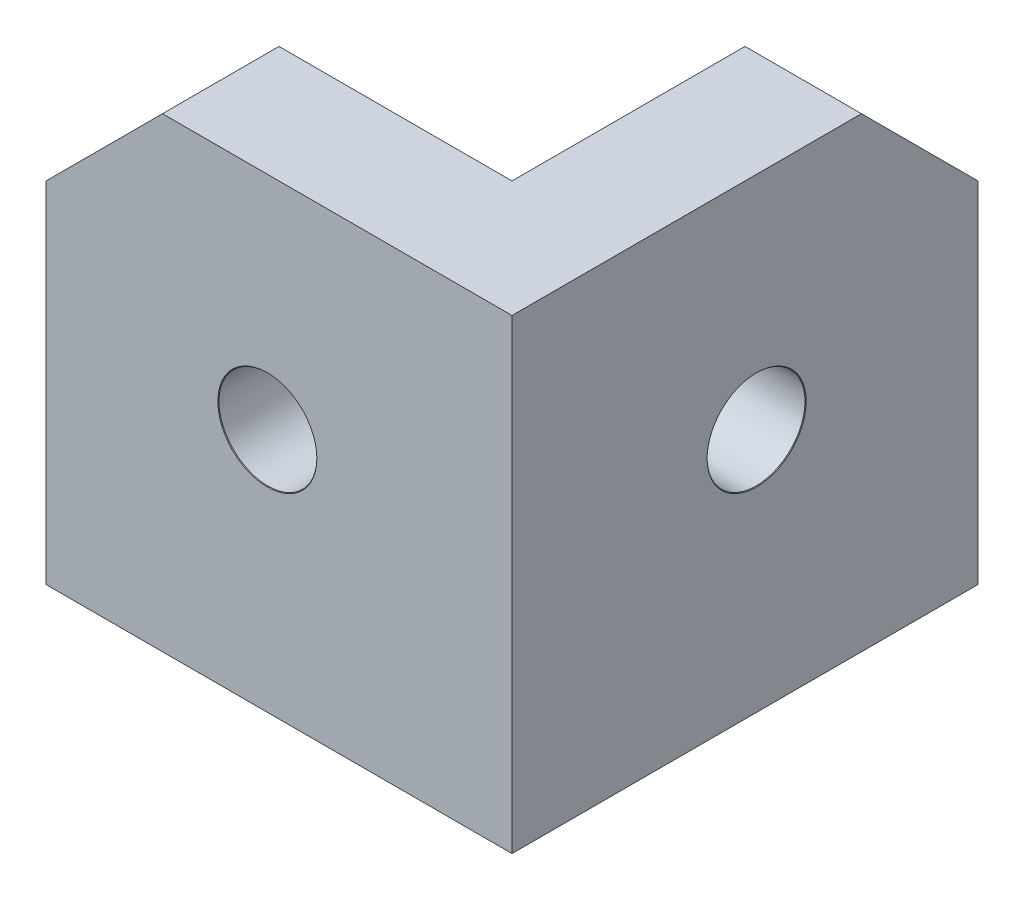
ISO-10303-21;
HEADER;
FILE_DESCRIPTION(('STEP AP214'),'2;1');
FILE_NAME('part.step','',(''),(''),'','','');
FILE_SCHEMA(('AUTOMOTIVE_DESIGN { 1 0 10303 214 1 1 1 1 }'));
ENDSEC;
DATA;
#1=APPLICATION_CONTEXT('core data for automotive mechanical design processes');
#2=APPLICATION_PROTOCOL_DEFINITION('international standard','automotive_design',2000,#1);
#3=PRODUCT_CONTEXT('',#1,'mechanical');
#4=PRODUCT('Part','Part','',(#3));
#5=PRODUCT_RELATED_PRODUCT_CATEGORY('part','',(#4));
#6=PRODUCT_DEFINITION_FORMATION('','',#4);
#7=PRODUCT_DEFINITION_CONTEXT('part definition',#1,'design');
#8=PRODUCT_DEFINITION('design','',#6,#7);
#9=PRODUCT_DEFINITION_SHAPE('','',#8);
#10=(LENGTH_UNIT() NAMED_UNIT(*) SI_UNIT(.MILLI.,.METRE.));
#11=(NAMED_UNIT(*) PLANE_ANGLE_UNIT() SI_UNIT($,.RADIAN.));
#12=(NAMED_UNIT(*) SI_UNIT($,.STERADIAN.) SOLID_ANGLE_UNIT());
#13=UNCERTAINTY_MEASURE_WITH_UNIT(LENGTH_MEASURE(1.E-05),#10,'distance_accuracy_value','');
#14=(GEOMETRIC_REPRESENTATION_CONTEXT(3) GLOBAL_UNCERTAINTY_ASSIGNED_CONTEXT((#13)) GLOBAL_UNIT_ASSIGNED_CONTEXT((#10,
#11,#12)) REPRESENTATION_CONTEXT('',''));
#15=CARTESIAN_POINT('',(0.,0.,0.));
#16=DIRECTION('',(0.,0.,1.));
#17=DIRECTION('',(1.,0.,0.));
#18=AXIS2_PLACEMENT_3D('',#15,#16,#17);
#19=CARTESIAN_POINT('',(0.,5.,0.));
#20=DIRECTION('',(0.,0.,1.));
#21=DIRECTION('',(1.,0.,0.));
#22=AXIS2_PLACEMENT_3D('',#19,#20,#21);
#23=PLANE('',#22);
#24=CARTESIAN_POINT('',(9.5,10.5,0.));
#25=DIRECTION('',(0.,0.,1.));
#26=DIRECTION('',(1.,0.,0.));
#27=AXIS2_PLACEMENT_3D('',#24,#25,#26);
#28=CIRCLE('',#27,2.125);
#29=CARTESIAN_POINT('',(11.625,10.5,0.));
#30=VERTEX_POINT('',#29);
#31=EDGE_CURVE('E211',#30,#30,#28,.T.);
#32=ORIENTED_EDGE('',*,*,#31,.F.);
#33=EDGE_LOOP('',(#32));
#34=FACE_BOUND('',#33,.T.);
#35=DIRECTION('',(1.,0.,0.));
#36=VECTOR('',#35,1.);
#37=CARTESIAN_POINT('',(0.,20.,0.));
#38=LINE('',#37,#36);
#39=CARTESIAN_POINT('',(5.00000000000002,20.,0.));
#40=VERTEX_POINT('',#39);
#41=CARTESIAN_POINT('',(20.,20.,0.));
#42=VERTEX_POINT('',#41);
#43=EDGE_CURVE('E144',#40,#42,#38,.T.);
#44=ORIENTED_EDGE('',*,*,#43,.F.);
#45=DIRECTION('',(0.707106781186548,0.707106781186547,0.));
#46=VECTOR('',#45,1.);
#47=CARTESIAN_POINT('',(-5.,10.,0.));
#48=LINE('',#47,#46);
#49=CARTESIAN_POINT('',(0.,15.,0.));
#50=VERTEX_POINT('',#49);
#51=EDGE_CURVE('E218',#40,#50,#48,.F.);
#52=ORIENTED_EDGE('',*,*,#51,.T.);
#53=DIRECTION('',(0.,-1.,0.));
#54=VECTOR('',#53,1.);
#55=CARTESIAN_POINT('',(0.,5.,0.));
#56=LINE('',#55,#54);
#57=CARTESIAN_POINT('',(0.,0.,0.));
#58=VERTEX_POINT('',#57);
#59=EDGE_CURVE('E179',#50,#58,#56,.T.);
#60=ORIENTED_EDGE('',*,*,#59,.T.);
#61=DIRECTION('',(-1.,0.,0.));
#62=VECTOR('',#61,1.);
#63=CARTESIAN_POINT('',(0.,0.,0.));
#64=LINE('',#63,#62);
#65=CARTESIAN_POINT('',(20.,0.,0.));
#66=VERTEX_POINT('',#65);
#67=EDGE_CURVE('E170',#66,#58,#64,.T.);
#68=ORIENTED_EDGE('',*,*,#67,.F.);
#69=DIRECTION('',(0.,-1.,0.));
#70=VECTOR('',#69,1.);
#71=CARTESIAN_POINT('',(20.,5.,0.));
#72=LINE('',#71,#70);
#73=EDGE_CURVE('E199',#42,#66,#72,.T.);
#74=ORIENTED_EDGE('',*,*,#73,.F.);
#75=EDGE_LOOP('',(#44,#52,#60,#68,#74));
#76=FACE_BOUND('',#75,.T.);
#77=ADVANCED_FACE('F40',(#34,#76),#23,.T.);
#78=CARTESIAN_POINT('',(20.,5.,0.));
#79=DIRECTION('',(-1.,0.,0.));
#80=DIRECTION('',(0.,0.,1.));
#81=AXIS2_PLACEMENT_3D('',#78,#79,#80);
#82=PLANE('',#81);
#83=CARTESIAN_POINT('',(20.,10.5,-10.5));
#84=DIRECTION('',(1.,0.,0.));
#85=DIRECTION('',(0.,0.,-1.));
#86=AXIS2_PLACEMENT_3D('',#83,#84,#85);
#87=CIRCLE('',#86,2.125);
#88=CARTESIAN_POINT('',(20.,10.5,-12.625));
#89=VERTEX_POINT('',#88);
#90=EDGE_CURVE('E501',#89,#89,#87,.T.);
#91=ORIENTED_EDGE('',*,*,#90,.F.);
#92=EDGE_LOOP('',(#91));
#93=FACE_BOUND('',#92,.T.);
#94=DIRECTION('',(0.,-1.,0.));
#95=VECTOR('',#94,1.);
#96=CARTESIAN_POINT('',(20.,5.,-20.));
#97=LINE('',#96,#95);
#98=CARTESIAN_POINT('',(20.,15.,-20.));
#99=VERTEX_POINT('',#98);
#100=CARTESIAN_POINT('',(20.,0.,-20.));
#101=VERTEX_POINT('',#100);
#102=EDGE_CURVE('E196',#99,#101,#97,.T.);
#103=ORIENTED_EDGE('',*,*,#102,.F.);
#104=DIRECTION('',(0.,-0.707106781186547,-0.707106781186548));
#105=VECTOR('',#104,1.);
#106=CARTESIAN_POINT('',(20.,20.,-15.));
#107=LINE('',#106,#105);
#108=CARTESIAN_POINT('',(20.,20.,-15.));
#109=VERTEX_POINT('',#108);
#110=EDGE_CURVE('E237',#99,#109,#107,.F.);
#111=ORIENTED_EDGE('',*,*,#110,.T.);
#112=DIRECTION('',(0.,0.,-1.));
#113=VECTOR('',#112,1.);
#114=CARTESIAN_POINT('',(20.,20.,0.));
#115=LINE('',#114,#113);
#116=EDGE_CURVE('E264',#42,#109,#115,.T.);
#117=ORIENTED_EDGE('',*,*,#116,.F.);
#118=ORIENTED_EDGE('',*,*,#73,.T.);
#119=DIRECTION('',(0.,0.,-1.));
#120=VECTOR('',#119,1.);
#121=CARTESIAN_POINT('',(20.,0.,0.));
#122=LINE('',#121,#120);
#123=EDGE_CURVE('E183',#66,#101,#122,.T.);
#124=ORIENTED_EDGE('',*,*,#123,.T.);
#125=EDGE_LOOP('',(#103,#111,#117,#118,#124));
#126=FACE_BOUND('',#125,.T.);
#127=ADVANCED_FACE('F277',(#93,#126),#82,.F.);
#128=CARTESIAN_POINT('',(0.,5.,-20.));
#129=DIRECTION('',(0.,0.,-1.));
#130=DIRECTION('',(-1.,0.,0.));
#131=AXIS2_PLACEMENT_3D('',#128,#129,#130);
#132=PLANE('',#131);
#133=DIRECTION('',(0.,-1.,0.));
#134=VECTOR('',#133,1.);
#135=CARTESIAN_POINT('',(15.,20.,-20.));
#136=LINE('',#135,#134);
#137=CARTESIAN_POINT('',(15.,15.,-20.));
#138=VERTEX_POINT('',#137);
#139=CARTESIAN_POINT('',(15.,5.,-20.));
#140=VERTEX_POINT('',#139);
#141=EDGE_CURVE('E159',#138,#140,#136,.T.);
#142=ORIENTED_EDGE('',*,*,#141,.F.);
#143=DIRECTION('',(1.,0.,0.));
#144=VECTOR('',#143,1.);
#145=CARTESIAN_POINT('',(0.,15.,-20.));
#146=LINE('',#145,#144);
#147=EDGE_CURVE('E57',#138,#99,#146,.T.);
#148=ORIENTED_EDGE('',*,*,#147,.T.);
#149=ORIENTED_EDGE('',*,*,#102,.T.);
#150=DIRECTION('',(1.,0.,0.));
#151=VECTOR('',#150,1.);
#152=CARTESIAN_POINT('',(0.,0.,-20.));
#153=LINE('',#152,#151);
#154=CARTESIAN_POINT('',(5.,0.,-20.));
#155=VERTEX_POINT('',#154);
#156=EDGE_CURVE('E187',#155,#101,#153,.T.);
#157=ORIENTED_EDGE('',*,*,#156,.F.);
#158=DIRECTION('',(0.,1.,0.));
#159=VECTOR('',#158,1.);
#160=CARTESIAN_POINT('',(5.,5.,-20.));
#161=LINE('',#160,#159);
#162=CARTESIAN_POINT('',(5.,5.,-20.));
#163=VERTEX_POINT('',#162);
#164=EDGE_CURVE('E64',#155,#163,#161,.T.);
#165=ORIENTED_EDGE('',*,*,#164,.T.);
#166=DIRECTION('',(1.,0.,0.));
#167=VECTOR('',#166,1.);
#168=CARTESIAN_POINT('',(0.,5.,-20.));
#169=LINE('',#168,#167);
#170=EDGE_CURVE('E171',#163,#140,#169,.T.);
#171=ORIENTED_EDGE('',*,*,#170,.T.);
#172=EDGE_LOOP('',(#142,#148,#149,#157,#165,#171));
#173=FACE_BOUND('',#172,.T.);
#174=ADVANCED_FACE('F246',(#173),#132,.T.);
#175=CARTESIAN_POINT('',(0.,5.,0.));
#176=DIRECTION('',(-1.,0.,0.));
#177=DIRECTION('',(0.,0.,1.));
#178=AXIS2_PLACEMENT_3D('',#175,#176,#177);
#179=PLANE('',#178);
#180=ORIENTED_EDGE('',*,*,#59,.F.);
#181=DIRECTION('',(0.,0.,-1.));
#182=VECTOR('',#181,1.);
#183=CARTESIAN_POINT('',(0.,15.,0.));
#184=LINE('',#183,#182);
#185=CARTESIAN_POINT('',(0.,15.,-5.));
#186=VERTEX_POINT('',#185);
#187=EDGE_CURVE('E225',#50,#186,#184,.T.);
#188=ORIENTED_EDGE('',*,*,#187,.T.);
#189=DIRECTION('',(0.,-1.,0.));
#190=VECTOR('',#189,1.);
#191=CARTESIAN_POINT('',(0.,20.,-5.));
#192=LINE('',#191,#190);
#193=CARTESIAN_POINT('',(0.,5.,-5.));
#194=VERTEX_POINT('',#193);
#195=EDGE_CURVE('E152',#186,#194,#192,.T.);
#196=ORIENTED_EDGE('',*,*,#195,.T.);
#197=DIRECTION('',(0.,0.,-1.));
#198=VECTOR('',#197,1.);
#199=CARTESIAN_POINT('',(0.,5.,0.));
#200=LINE('',#199,#198);
#201=CARTESIAN_POINT('',(0.,5.,-15.));
#202=VERTEX_POINT('',#201);
#203=EDGE_CURVE('E174',#194,#202,#200,.T.);
#204=ORIENTED_EDGE('',*,*,#203,.T.);
#205=DIRECTION('',(0.,-1.,0.));
#206=VECTOR('',#205,1.);
#207=CARTESIAN_POINT('',(0.,5.,-15.));
#208=LINE('',#207,#206);
#209=CARTESIAN_POINT('',(0.,0.,-15.));
#210=VERTEX_POINT('',#209);
#211=EDGE_CURVE('E221',#202,#210,#208,.T.);
#212=ORIENTED_EDGE('',*,*,#211,.T.);
#213=DIRECTION('',(0.,0.,-1.));
#214=VECTOR('',#213,1.);
#215=CARTESIAN_POINT('',(0.,0.,0.));
#216=LINE('',#215,#214);
#217=EDGE_CURVE('E175',#58,#210,#216,.T.);
#218=ORIENTED_EDGE('',*,*,#217,.F.);
#219=EDGE_LOOP('',(#180,#188,#196,#204,#212,#218));
#220=FACE_BOUND('',#219,.T.);
#221=ADVANCED_FACE('F254',(#220),#179,.T.);
#222=CARTESIAN_POINT('',(0.,5.,0.));
#223=DIRECTION('',(0.,1.,0.));
#224=DIRECTION('',(0.,0.,1.));
#225=AXIS2_PLACEMENT_3D('',#222,#223,#224);
#226=PLANE('',#225);
#227=ORIENTED_EDGE('',*,*,#170,.F.);
#228=DIRECTION('',(0.707106781186546,0.,-0.707106781186549));
#229=VECTOR('',#228,1.);
#230=CARTESIAN_POINT('',(-7.49999999999999,5.,-7.49999999999996));
#231=LINE('',#230,#229);
#232=EDGE_CURVE('E11',#163,#202,#231,.F.);
#233=ORIENTED_EDGE('',*,*,#232,.T.);
#234=ORIENTED_EDGE('',*,*,#203,.F.);
#235=DIRECTION('',(-1.,0.,0.));
#236=VECTOR('',#235,1.);
#237=CARTESIAN_POINT('',(0.,5.,-5.));
#238=LINE('',#237,#236);
#239=CARTESIAN_POINT('',(15.,5.,-5.));
#240=VERTEX_POINT('',#239);
#241=EDGE_CURVE('E132',#240,#194,#238,.T.);
#242=ORIENTED_EDGE('',*,*,#241,.F.);
#243=DIRECTION('',(0.,0.,1.));
#244=VECTOR('',#243,1.);
#245=CARTESIAN_POINT('',(15.,5.,0.));
#246=LINE('',#245,#244);
#247=EDGE_CURVE('E149',#140,#240,#246,.T.);
#248=ORIENTED_EDGE('',*,*,#247,.F.);
#249=EDGE_LOOP('',(#227,#233,#234,#242,#248));
#250=FACE_BOUND('',#249,.T.);
#251=CARTESIAN_POINT('',(9.5,5.,-10.5));
#252=DIRECTION('',(0.,-1.,0.));
#253=DIRECTION('',(0.,0.,-1.));
#254=AXIS2_PLACEMENT_3D('',#251,#252,#253);
#255=CIRCLE('',#254,2.1);
#256=CARTESIAN_POINT('',(9.5,5.,-12.6));
#257=VERTEX_POINT('',#256);
#258=EDGE_CURVE('E166',#257,#257,#255,.T.);
#259=ORIENTED_EDGE('',*,*,#258,.T.);
#260=EDGE_LOOP('',(#259));
#261=FACE_BOUND('',#260,.T.);
#262=ADVANCED_FACE('F250',(#250,#261),#226,.T.);
#263=CARTESIAN_POINT('',(0.,0.,0.));
#264=DIRECTION('',(0.,1.,0.));
#265=DIRECTION('',(0.,0.,1.));
#266=AXIS2_PLACEMENT_3D('',#263,#264,#265);
#267=PLANE('',#266);
#268=CARTESIAN_POINT('',(9.5,0.,-10.5));
#269=DIRECTION('',(0.,-1.,0.));
#270=DIRECTION('',(0.,0.,-1.));
#271=AXIS2_PLACEMENT_3D('',#268,#269,#270);
#272=CIRCLE('',#271,2.125);
#273=CARTESIAN_POINT('',(9.5,0.,-12.625));
#274=VERTEX_POINT('',#273);
#275=EDGE_CURVE('E151',#274,#274,#272,.T.);
#276=ORIENTED_EDGE('',*,*,#275,.F.);
#277=EDGE_LOOP('',(#276));
#278=FACE_BOUND('',#277,.T.);
#279=ORIENTED_EDGE('',*,*,#217,.T.);
#280=DIRECTION('',(-0.707106781186546,0.,0.707106781186549));
#281=VECTOR('',#280,1.);
#282=CARTESIAN_POINT('',(0.,0.,-15.));
#283=LINE('',#282,#281);
#284=EDGE_CURVE('E50',#210,#155,#283,.F.);
#285=ORIENTED_EDGE('',*,*,#284,.T.);
#286=ORIENTED_EDGE('',*,*,#156,.T.);
#287=ORIENTED_EDGE('',*,*,#123,.F.);
#288=ORIENTED_EDGE('',*,*,#67,.T.);
#289=EDGE_LOOP('',(#279,#285,#286,#287,#288));
#290=FACE_BOUND('',#289,.T.);
#291=ADVANCED_FACE('F241',(#278,#290),#267,.F.);
#292=CARTESIAN_POINT('',(9.5,0.,-10.5));
#293=DIRECTION('',(0.,-1.,0.));
#294=DIRECTION('',(0.,0.,-1.));
#295=AXIS2_PLACEMENT_3D('',#292,#293,#294);
#296=CYLINDRICAL_SURFACE('',#295,2.1);
#297=ORIENTED_EDGE('',*,*,#258,.F.);
#298=EDGE_LOOP('',(#297));
#299=FACE_BOUND('',#298,.T.);
#300=CARTESIAN_POINT('',(9.5,0.0250000000000013,-10.5));
#301=DIRECTION('',(0.,-1.,0.));
#302=DIRECTION('',(0.,0.,-1.));
#303=AXIS2_PLACEMENT_3D('',#300,#301,#302);
#304=CIRCLE('',#303,2.1);
#305=CARTESIAN_POINT('',(9.5,0.0250000000000013,-12.6));
#306=VERTEX_POINT('',#305);
#307=EDGE_CURVE('E157',#306,#306,#304,.T.);
#308=ORIENTED_EDGE('',*,*,#307,.T.);
#309=EDGE_LOOP('',(#308));
#310=FACE_BOUND('',#309,.T.);
#311=ADVANCED_FACE('F349',(#299,#310),#296,.F.);
#312=CARTESIAN_POINT('',(9.5,0.,-10.5));
#313=DIRECTION('',(0.,-1.,0.));
#314=DIRECTION('',(0.,0.,-1.));
#315=AXIS2_PLACEMENT_3D('',#312,#313,#314);
#316=CONICAL_SURFACE('',#315,2.125,0.785398163397437);
#317=ORIENTED_EDGE('',*,*,#307,.F.);
#318=EDGE_LOOP('',(#317));
#319=FACE_BOUND('',#318,.T.);
#320=ORIENTED_EDGE('',*,*,#275,.T.);
#321=EDGE_LOOP('',(#320));
#322=FACE_BOUND('',#321,.T.);
#323=ADVANCED_FACE('F340',(#319,#322),#316,.F.);
#324=CARTESIAN_POINT('',(15.,20.,0.));
#325=DIRECTION('',(1.,0.,0.));
#326=DIRECTION('',(0.,0.,-1.));
#327=AXIS2_PLACEMENT_3D('',#324,#325,#326);
#328=PLANE('',#327);
#329=CARTESIAN_POINT('',(15.,10.5,-10.5));
#330=DIRECTION('',(1.,0.,0.));
#331=DIRECTION('',(0.,0.,-1.));
#332=AXIS2_PLACEMENT_3D('',#329,#330,#331);
#333=CIRCLE('',#332,2.09999999999999);
#334=CARTESIAN_POINT('',(15.,10.5,-12.6));
#335=VERTEX_POINT('',#334);
#336=EDGE_CURVE('E207',#335,#335,#333,.T.);
#337=ORIENTED_EDGE('',*,*,#336,.T.);
#338=EDGE_LOOP('',(#337));
#339=FACE_BOUND('',#338,.T.);
#340=DIRECTION('',(0.,0.,1.));
#341=VECTOR('',#340,1.);
#342=CARTESIAN_POINT('',(15.,20.,0.));
#343=LINE('',#342,#341);
#344=CARTESIAN_POINT('',(15.,20.,-15.));
#345=VERTEX_POINT('',#344);
#346=CARTESIAN_POINT('',(15.,20.,-5.));
#347=VERTEX_POINT('',#346);
#348=EDGE_CURVE('E120',#345,#347,#343,.T.);
#349=ORIENTED_EDGE('',*,*,#348,.F.);
#350=DIRECTION('',(0.,0.707106781186547,0.707106781186548));
#351=VECTOR('',#350,1.);
#352=CARTESIAN_POINT('',(15.,20.,-15.));
#353=LINE('',#352,#351);
#354=EDGE_CURVE('E230',#345,#138,#353,.F.);
#355=ORIENTED_EDGE('',*,*,#354,.T.);
#356=ORIENTED_EDGE('',*,*,#141,.T.);
#357=ORIENTED_EDGE('',*,*,#247,.T.);
#358=DIRECTION('',(0.,-1.,0.));
#359=VECTOR('',#358,1.);
#360=CARTESIAN_POINT('',(15.,20.,-5.));
#361=LINE('',#360,#359);
#362=EDGE_CURVE('E139',#347,#240,#361,.T.);
#363=ORIENTED_EDGE('',*,*,#362,.F.);
#364=EDGE_LOOP('',(#349,#355,#356,#357,#363));
#365=FACE_BOUND('',#364,.T.);
#366=ADVANCED_FACE('F146',(#339,#365),#328,.F.);
#367=CARTESIAN_POINT('',(0.,20.,-5.));
#368=DIRECTION('',(0.,0.,1.));
#369=DIRECTION('',(1.,0.,0.));
#370=AXIS2_PLACEMENT_3D('',#367,#368,#369);
#371=PLANE('',#370);
#372=CARTESIAN_POINT('',(9.5,10.5,-5.));
#373=DIRECTION('',(0.,0.,1.));
#374=DIRECTION('',(1.,0.,0.));
#375=AXIS2_PLACEMENT_3D('',#372,#373,#374);
#376=CIRCLE('',#375,2.09999999999999);
#377=CARTESIAN_POINT('',(11.6,10.5,-5.));
#378=VERTEX_POINT('',#377);
#379=EDGE_CURVE('E202',#378,#378,#376,.T.);
#380=ORIENTED_EDGE('',*,*,#379,.T.);
#381=EDGE_LOOP('',(#380));
#382=FACE_BOUND('',#381,.T.);
#383=ORIENTED_EDGE('',*,*,#195,.F.);
#384=DIRECTION('',(-0.707106781186548,-0.707106781186547,0.));
#385=VECTOR('',#384,1.);
#386=CARTESIAN_POINT('',(5.00000000000002,20.,-5.));
#387=LINE('',#386,#385);
#388=CARTESIAN_POINT('',(5.00000000000002,20.,-5.));
#389=VERTEX_POINT('',#388);
#390=EDGE_CURVE('E142',#186,#389,#387,.F.);
#391=ORIENTED_EDGE('',*,*,#390,.T.);
#392=DIRECTION('',(-1.,0.,0.));
#393=VECTOR('',#392,1.);
#394=CARTESIAN_POINT('',(0.,20.,-5.));
#395=LINE('',#394,#393);
#396=EDGE_CURVE('E124',#347,#389,#395,.T.);
#397=ORIENTED_EDGE('',*,*,#396,.F.);
#398=ORIENTED_EDGE('',*,*,#362,.T.);
#399=ORIENTED_EDGE('',*,*,#241,.T.);
#400=EDGE_LOOP('',(#383,#391,#397,#398,#399));
#401=FACE_BOUND('',#400,.T.);
#402=ADVANCED_FACE('F137',(#382,#401),#371,.F.);
#403=CARTESIAN_POINT('',(0.,20.,0.));
#404=DIRECTION('',(0.,1.,0.));
#405=DIRECTION('',(0.,0.,1.));
#406=AXIS2_PLACEMENT_3D('',#403,#404,#405);
#407=PLANE('',#406);
#408=ORIENTED_EDGE('',*,*,#396,.T.);
#409=DIRECTION('',(0.,0.,1.));
#410=VECTOR('',#409,1.);
#411=CARTESIAN_POINT('',(5.00000000000002,20.,0.));
#412=LINE('',#411,#410);
#413=EDGE_CURVE('E215',#389,#40,#412,.T.);
#414=ORIENTED_EDGE('',*,*,#413,.T.);
#415=ORIENTED_EDGE('',*,*,#43,.T.);
#416=ORIENTED_EDGE('',*,*,#116,.T.);
#417=DIRECTION('',(-1.,0.,0.));
#418=VECTOR('',#417,1.);
#419=CARTESIAN_POINT('',(0.,20.,-15.));
#420=LINE('',#419,#418);
#421=EDGE_CURVE('E128',#109,#345,#420,.T.);
#422=ORIENTED_EDGE('',*,*,#421,.T.);
#423=ORIENTED_EDGE('',*,*,#348,.T.);
#424=EDGE_LOOP('',(#408,#414,#415,#416,#422,#423));
#425=FACE_BOUND('',#424,.T.);
#426=ADVANCED_FACE('F122',(#425),#407,.T.);
#427=CARTESIAN_POINT('',(9.5,10.5,0.));
#428=DIRECTION('',(0.,0.,1.));
#429=DIRECTION('',(1.,0.,0.));
#430=AXIS2_PLACEMENT_3D('',#427,#428,#429);
#431=CYLINDRICAL_SURFACE('',#430,2.09999999999999);
#432=CARTESIAN_POINT('',(9.5,10.5,-0.0249999999999972));
#433=DIRECTION('',(0.,0.,1.));
#434=DIRECTION('',(1.,0.,0.));
#435=AXIS2_PLACEMENT_3D('',#432,#433,#434);
#436=CIRCLE('',#435,2.09999999999999);
#437=CARTESIAN_POINT('',(11.6,10.5,-0.0249999999999972));
#438=VERTEX_POINT('',#437);
#439=EDGE_CURVE('E206',#438,#438,#436,.T.);
#440=ORIENTED_EDGE('',*,*,#439,.T.);
#441=EDGE_LOOP('',(#440));
#442=FACE_BOUND('',#441,.T.);
#443=ORIENTED_EDGE('',*,*,#379,.F.);
#444=EDGE_LOOP('',(#443));
#445=FACE_BOUND('',#444,.T.);
#446=ADVANCED_FACE('F325',(#442,#445),#431,.F.);
#447=CARTESIAN_POINT('',(9.5,10.5,0.));
#448=DIRECTION('',(0.,0.,1.));
#449=DIRECTION('',(1.,0.,0.));
#450=AXIS2_PLACEMENT_3D('',#447,#448,#449);
#451=CONICAL_SURFACE('',#450,2.125,0.785398163397726);
#452=ORIENTED_EDGE('',*,*,#439,.F.);
#453=EDGE_LOOP('',(#452));
#454=FACE_BOUND('',#453,.T.);
#455=ORIENTED_EDGE('',*,*,#31,.T.);
#456=EDGE_LOOP('',(#455));
#457=FACE_BOUND('',#456,.T.);
#458=ADVANCED_FACE('F399',(#454,#457),#451,.F.);
#459=CARTESIAN_POINT('',(20.,10.5,-10.5));
#460=DIRECTION('',(1.,0.,0.));
#461=DIRECTION('',(0.,0.,-1.));
#462=AXIS2_PLACEMENT_3D('',#459,#460,#461);
#463=CYLINDRICAL_SURFACE('',#462,2.09999999999999);
#464=CARTESIAN_POINT('',(19.975,10.5,-10.5));
#465=DIRECTION('',(1.,0.,0.));
#466=DIRECTION('',(0.,0.,-1.));
#467=AXIS2_PLACEMENT_3D('',#464,#465,#466);
#468=CIRCLE('',#467,2.09999999999999);
#469=CARTESIAN_POINT('',(19.975,10.5,-12.6));
#470=VERTEX_POINT('',#469);
#471=EDGE_CURVE('E212',#470,#470,#468,.T.);
#472=ORIENTED_EDGE('',*,*,#471,.T.);
#473=EDGE_LOOP('',(#472));
#474=FACE_BOUND('',#473,.T.);
#475=ORIENTED_EDGE('',*,*,#336,.F.);
#476=EDGE_LOOP('',(#475));
#477=FACE_BOUND('',#476,.T.);
#478=ADVANCED_FACE('F389',(#474,#477),#463,.F.);
#479=CARTESIAN_POINT('',(20.,10.5,-10.5));
#480=DIRECTION('',(1.,0.,0.));
#481=DIRECTION('',(0.,0.,-1.));
#482=AXIS2_PLACEMENT_3D('',#479,#480,#481);
#483=CONICAL_SURFACE('',#482,2.125,0.785398163397691);
#484=ORIENTED_EDGE('',*,*,#471,.F.);
#485=EDGE_LOOP('',(#484));
#486=FACE_BOUND('',#485,.T.);
#487=ORIENTED_EDGE('',*,*,#90,.T.);
#488=EDGE_LOOP('',(#487));
#489=FACE_BOUND('',#488,.T.);
#490=ADVANCED_FACE('F296',(#486,#489),#483,.F.);
#491=CARTESIAN_POINT('',(5.00000000000002,20.,0.));
#492=DIRECTION('',(0.707106781186547,-0.707106781186548,0.));
#493=DIRECTION('',(0.,0.,1.));
#494=AXIS2_PLACEMENT_3D('',#491,#492,#493);
#495=PLANE('',#494);
#496=ORIENTED_EDGE('',*,*,#390,.F.);
#497=ORIENTED_EDGE('',*,*,#187,.F.);
#498=ORIENTED_EDGE('',*,*,#51,.F.);
#499=ORIENTED_EDGE('',*,*,#413,.F.);
#500=EDGE_LOOP('',(#496,#497,#498,#499));
#501=FACE_BOUND('',#500,.T.);
#502=ADVANCED_FACE('F257',(#501),#495,.F.);
#503=CARTESIAN_POINT('',(0.,20.,-15.));
#504=DIRECTION('',(0.,-0.707106781186548,0.707106781186547));
#505=DIRECTION('',(-1.,0.,0.));
#506=AXIS2_PLACEMENT_3D('',#503,#504,#505);
#507=PLANE('',#506);
#508=ORIENTED_EDGE('',*,*,#110,.F.);
#509=ORIENTED_EDGE('',*,*,#147,.F.);
#510=ORIENTED_EDGE('',*,*,#354,.F.);
#511=ORIENTED_EDGE('',*,*,#421,.F.);
#512=EDGE_LOOP('',(#508,#509,#510,#511));
#513=FACE_BOUND('',#512,.T.);
#514=ADVANCED_FACE('F275',(#513),#507,.F.);
#515=CARTESIAN_POINT('',(0.,5.,-15.));
#516=DIRECTION('',(0.707106781186549,0.,0.707106781186546));
#517=DIRECTION('',(0.,-1.,0.));
#518=AXIS2_PLACEMENT_3D('',#515,#516,#517);
#519=PLANE('',#518);
#520=ORIENTED_EDGE('',*,*,#232,.F.);
#521=ORIENTED_EDGE('',*,*,#164,.F.);
#522=ORIENTED_EDGE('',*,*,#284,.F.);
#523=ORIENTED_EDGE('',*,*,#211,.F.);
#524=EDGE_LOOP('',(#520,#521,#522,#523));
#525=FACE_BOUND('',#524,.T.);
#526=ADVANCED_FACE('F43',(#525),#519,.F.);
#527=CLOSED_SHELL('',(#77,#127,#174,#221,#262,#291,#311,#323,#366,#402,#426,#446,#458,#478,#490,
#502,#514,#526));
#528=MANIFOLD_SOLID_BREP('B2',#527);
#529=ADVANCED_BREP_SHAPE_REPRESENTATION('',(#18,#528),#14);
#530=SHAPE_DEFINITION_REPRESENTATION(#9,#529);
ENDSEC;
END-ISO-10303-21;
